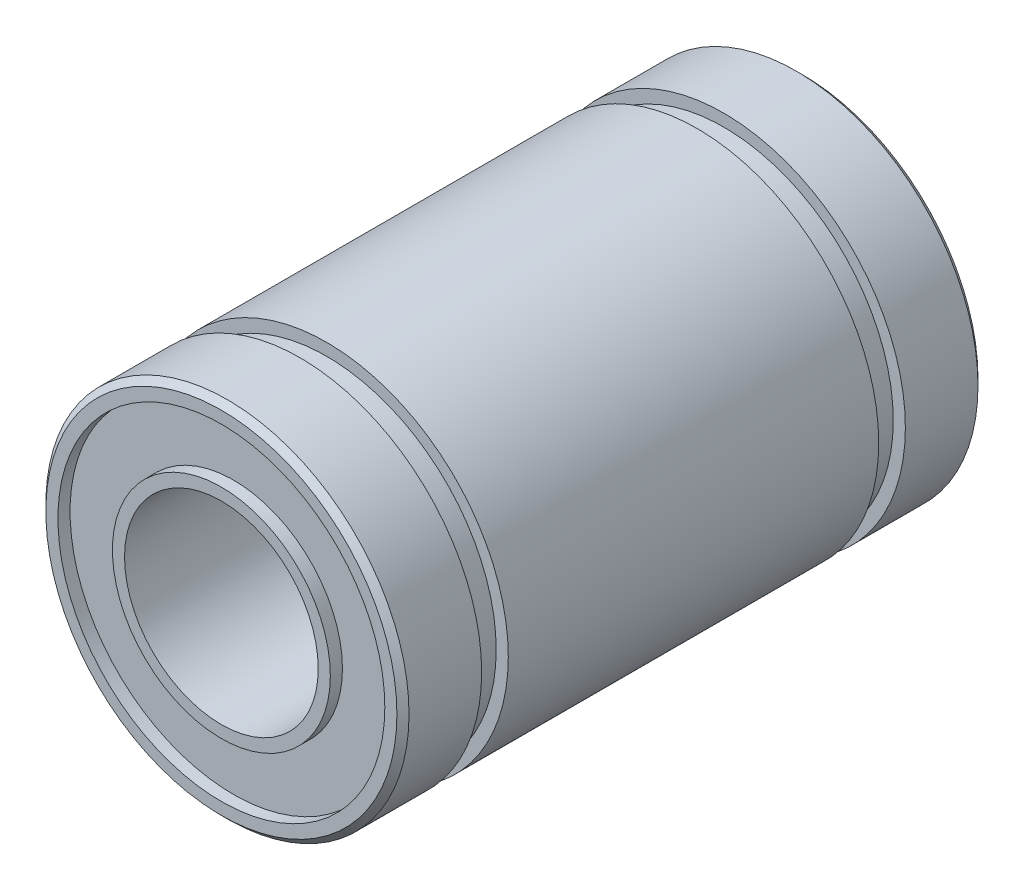
ISO-10303-21;
HEADER;
FILE_DESCRIPTION(('STEP AP214'),'2;1');
FILE_NAME('part.step','',(''),(''),'','','');
FILE_SCHEMA(('AUTOMOTIVE_DESIGN { 1 0 10303 214 1 1 1 1 }'));
ENDSEC;
DATA;
#1=APPLICATION_CONTEXT('core data for automotive mechanical design processes');
#2=APPLICATION_PROTOCOL_DEFINITION('international standard','automotive_design',2000,#1);
#3=PRODUCT_CONTEXT('',#1,'mechanical');
#4=PRODUCT('Part','Part','',(#3));
#5=PRODUCT_RELATED_PRODUCT_CATEGORY('part','',(#4));
#6=PRODUCT_DEFINITION_FORMATION('','',#4);
#7=PRODUCT_DEFINITION_CONTEXT('part definition',#1,'design');
#8=PRODUCT_DEFINITION('design','',#6,#7);
#9=PRODUCT_DEFINITION_SHAPE('','',#8);
#10=(LENGTH_UNIT() NAMED_UNIT(*) SI_UNIT(.MILLI.,.METRE.));
#11=(NAMED_UNIT(*) PLANE_ANGLE_UNIT() SI_UNIT($,.RADIAN.));
#12=(NAMED_UNIT(*) SI_UNIT($,.STERADIAN.) SOLID_ANGLE_UNIT());
#13=UNCERTAINTY_MEASURE_WITH_UNIT(LENGTH_MEASURE(1.E-05),#10,'distance_accuracy_value','');
#14=(GEOMETRIC_REPRESENTATION_CONTEXT(3) GLOBAL_UNCERTAINTY_ASSIGNED_CONTEXT((#13)) GLOBAL_UNIT_ASSIGNED_CONTEXT((#10,
#11,#12)) REPRESENTATION_CONTEXT('',''));
#15=CARTESIAN_POINT('',(0.,0.,0.));
#16=DIRECTION('',(0.,0.,1.));
#17=DIRECTION('',(1.,0.,0.));
#18=AXIS2_PLACEMENT_3D('',#15,#16,#17);
#19=CARTESIAN_POINT('',(0.,0.,-11.875));
#20=DIRECTION('',(0.,0.,1.));
#21=DIRECTION('',(-1.,0.,0.));
#22=AXIS2_PLACEMENT_3D('',#19,#20,#21);
#23=CONICAL_SURFACE('',#22,7.375,0.785398163400002);
#24=CARTESIAN_POINT('',(0.,0.,-11.75));
#25=DIRECTION('',(0.,0.,-1.));
#26=DIRECTION('',(-1.,0.,0.));
#27=AXIS2_PLACEMENT_3D('',#24,#25,#26);
#28=CIRCLE('',#27,7.5);
#29=CARTESIAN_POINT('',(7.5,0.,-11.75));
#30=VERTEX_POINT('',#29);
#31=EDGE_CURVE('E10',#30,#30,#28,.T.);
#32=ORIENTED_EDGE('',*,*,#31,.T.);
#33=EDGE_LOOP('',(#32));
#34=FACE_BOUND('',#33,.T.);
#35=CARTESIAN_POINT('',(0.,0.,-12.));
#36=DIRECTION('',(0.,0.,1.));
#37=DIRECTION('',(-1.,0.,0.));
#38=AXIS2_PLACEMENT_3D('',#35,#36,#37);
#39=CIRCLE('',#38,7.25);
#40=CARTESIAN_POINT('',(7.25,0.,-12.));
#41=VERTEX_POINT('',#40);
#42=EDGE_CURVE('E28',#41,#41,#39,.T.);
#43=ORIENTED_EDGE('',*,*,#42,.T.);
#44=EDGE_LOOP('',(#43));
#45=FACE_BOUND('',#44,.T.);
#46=ADVANCED_FACE('F17',(#34,#45),#23,.T.);
#47=CARTESIAN_POINT('',(0.,0.,0.));
#48=DIRECTION('',(0.,0.,1.));
#49=DIRECTION('',(-1.,0.,0.));
#50=AXIS2_PLACEMENT_3D('',#47,#48,#49);
#51=CYLINDRICAL_SURFACE('',#50,7.5);
#52=CARTESIAN_POINT('',(0.,0.,-8.75));
#53=DIRECTION('',(0.,0.,-1.));
#54=DIRECTION('',(-1.,0.,0.));
#55=AXIS2_PLACEMENT_3D('',#52,#53,#54);
#56=CIRCLE('',#55,7.5);
#57=CARTESIAN_POINT('',(7.5,0.,-8.75));
#58=VERTEX_POINT('',#57);
#59=EDGE_CURVE('E170',#58,#58,#56,.T.);
#60=ORIENTED_EDGE('',*,*,#59,.T.);
#61=EDGE_LOOP('',(#60));
#62=FACE_BOUND('',#61,.T.);
#63=ORIENTED_EDGE('',*,*,#31,.F.);
#64=EDGE_LOOP('',(#63));
#65=FACE_BOUND('',#64,.T.);
#66=ADVANCED_FACE('F236',(#62,#65),#51,.T.);
#67=CARTESIAN_POINT('',(0.,0.,-12.));
#68=DIRECTION('',(0.,0.,1.));
#69=DIRECTION('',(1.,0.,0.));
#70=AXIS2_PLACEMENT_3D('',#67,#68,#69);
#71=PLANE('',#70);
#72=ORIENTED_EDGE('',*,*,#42,.F.);
#73=EDGE_LOOP('',(#72));
#74=FACE_BOUND('',#73,.T.);
#75=CARTESIAN_POINT('',(0.,0.,-12.));
#76=DIRECTION('',(0.,0.,1.));
#77=DIRECTION('',(-1.,0.,0.));
#78=AXIS2_PLACEMENT_3D('',#75,#76,#77);
#79=CIRCLE('',#78,6.75);
#80=CARTESIAN_POINT('',(6.75,0.,-12.));
#81=VERTEX_POINT('',#80);
#82=EDGE_CURVE('E150',#81,#81,#79,.T.);
#83=ORIENTED_EDGE('',*,*,#82,.T.);
#84=EDGE_LOOP('',(#83));
#85=FACE_BOUND('',#84,.T.);
#86=ADVANCED_FACE('F268',(#74,#85),#71,.F.);
#87=CARTESIAN_POINT('',(0.,0.,11.875));
#88=DIRECTION('',(0.,0.,-1.));
#89=DIRECTION('',(-1.,0.,0.));
#90=AXIS2_PLACEMENT_3D('',#87,#88,#89);
#91=CONICAL_SURFACE('',#90,7.375,0.785398163400002);
#92=CARTESIAN_POINT('',(0.,0.,11.75));
#93=DIRECTION('',(0.,0.,1.));
#94=DIRECTION('',(-1.,0.,0.));
#95=AXIS2_PLACEMENT_3D('',#92,#93,#94);
#96=CIRCLE('',#95,7.5);
#97=CARTESIAN_POINT('',(7.5,0.,11.75));
#98=VERTEX_POINT('',#97);
#99=EDGE_CURVE('E141',#98,#98,#96,.T.);
#100=ORIENTED_EDGE('',*,*,#99,.T.);
#101=EDGE_LOOP('',(#100));
#102=FACE_BOUND('',#101,.T.);
#103=CARTESIAN_POINT('',(0.,0.,12.));
#104=DIRECTION('',(0.,0.,-1.));
#105=DIRECTION('',(-1.,0.,0.));
#106=AXIS2_PLACEMENT_3D('',#103,#104,#105);
#107=CIRCLE('',#106,7.25);
#108=CARTESIAN_POINT('',(7.25,0.,12.));
#109=VERTEX_POINT('',#108);
#110=EDGE_CURVE('E136',#109,#109,#107,.T.);
#111=ORIENTED_EDGE('',*,*,#110,.T.);
#112=EDGE_LOOP('',(#111));
#113=FACE_BOUND('',#112,.T.);
#114=ADVANCED_FACE('F277',(#102,#113),#91,.T.);
#115=CARTESIAN_POINT('',(0.,0.,12.));
#116=DIRECTION('',(0.,0.,1.));
#117=DIRECTION('',(1.,0.,0.));
#118=AXIS2_PLACEMENT_3D('',#115,#116,#117);
#119=PLANE('',#118);
#120=ORIENTED_EDGE('',*,*,#110,.F.);
#121=EDGE_LOOP('',(#120));
#122=FACE_BOUND('',#121,.T.);
#123=CARTESIAN_POINT('',(0.,0.,12.));
#124=DIRECTION('',(0.,0.,-1.));
#125=DIRECTION('',(-1.,0.,0.));
#126=AXIS2_PLACEMENT_3D('',#123,#124,#125);
#127=CIRCLE('',#126,6.75);
#128=CARTESIAN_POINT('',(6.75,0.,12.));
#129=VERTEX_POINT('',#128);
#130=EDGE_CURVE('E142',#129,#129,#127,.T.);
#131=ORIENTED_EDGE('',*,*,#130,.T.);
#132=EDGE_LOOP('',(#131));
#133=FACE_BOUND('',#132,.T.);
#134=ADVANCED_FACE('F137',(#122,#133),#119,.T.);
#135=CARTESIAN_POINT('',(0.,0.,0.));
#136=DIRECTION('',(0.,0.,1.));
#137=DIRECTION('',(-1.,0.,0.));
#138=AXIS2_PLACEMENT_3D('',#135,#136,#137);
#139=CYLINDRICAL_SURFACE('',#138,7.5);
#140=CARTESIAN_POINT('',(0.,0.,8.75));
#141=DIRECTION('',(0.,0.,1.));
#142=DIRECTION('',(-1.,0.,0.));
#143=AXIS2_PLACEMENT_3D('',#140,#141,#142);
#144=CIRCLE('',#143,7.5);
#145=CARTESIAN_POINT('',(7.5,0.,8.75));
#146=VERTEX_POINT('',#145);
#147=EDGE_CURVE('E153',#146,#146,#144,.T.);
#148=ORIENTED_EDGE('',*,*,#147,.T.);
#149=EDGE_LOOP('',(#148));
#150=FACE_BOUND('',#149,.T.);
#151=ORIENTED_EDGE('',*,*,#99,.F.);
#152=EDGE_LOOP('',(#151));
#153=FACE_BOUND('',#152,.T.);
#154=ADVANCED_FACE('F19',(#150,#153),#139,.T.);
#155=CARTESIAN_POINT('',(0.,0.,8.75));
#156=DIRECTION('',(0.,0.,1.));
#157=DIRECTION('',(1.,0.,0.));
#158=AXIS2_PLACEMENT_3D('',#155,#156,#157);
#159=PLANE('',#158);
#160=ORIENTED_EDGE('',*,*,#147,.F.);
#161=EDGE_LOOP('',(#160));
#162=FACE_BOUND('',#161,.T.);
#163=CARTESIAN_POINT('',(0.,0.,8.75));
#164=DIRECTION('',(0.,0.,-1.));
#165=DIRECTION('',(-1.,0.,0.));
#166=AXIS2_PLACEMENT_3D('',#163,#164,#165);
#167=CIRCLE('',#166,7.);
#168=CARTESIAN_POINT('',(7.,0.,8.75));
#169=VERTEX_POINT('',#168);
#170=EDGE_CURVE('E186',#169,#169,#167,.T.);
#171=ORIENTED_EDGE('',*,*,#170,.F.);
#172=EDGE_LOOP('',(#171));
#173=FACE_BOUND('',#172,.T.);
#174=ADVANCED_FACE('F301',(#162,#173),#159,.F.);
#175=CARTESIAN_POINT('',(0.,0.,7.65));
#176=DIRECTION('',(0.,0.,1.));
#177=DIRECTION('',(1.,0.,0.));
#178=AXIS2_PLACEMENT_3D('',#175,#176,#177);
#179=PLANE('',#178);
#180=CARTESIAN_POINT('',(0.,0.,7.65));
#181=DIRECTION('',(0.,0.,-1.));
#182=DIRECTION('',(-1.,0.,0.));
#183=AXIS2_PLACEMENT_3D('',#180,#181,#182);
#184=CIRCLE('',#183,7.5);
#185=CARTESIAN_POINT('',(7.5,0.,7.65));
#186=VERTEX_POINT('',#185);
#187=EDGE_CURVE('E157',#186,#186,#184,.T.);
#188=ORIENTED_EDGE('',*,*,#187,.F.);
#189=EDGE_LOOP('',(#188));
#190=FACE_BOUND('',#189,.T.);
#191=CARTESIAN_POINT('',(0.,0.,7.65));
#192=DIRECTION('',(0.,0.,1.));
#193=DIRECTION('',(-1.,0.,0.));
#194=AXIS2_PLACEMENT_3D('',#191,#192,#193);
#195=CIRCLE('',#194,7.);
#196=CARTESIAN_POINT('',(7.,0.,7.65));
#197=VERTEX_POINT('',#196);
#198=EDGE_CURVE('E190',#197,#197,#195,.T.);
#199=ORIENTED_EDGE('',*,*,#198,.F.);
#200=EDGE_LOOP('',(#199));
#201=FACE_BOUND('',#200,.T.);
#202=ADVANCED_FACE('F289',(#190,#201),#179,.T.);
#203=CARTESIAN_POINT('',(0.,0.,8.75));
#204=DIRECTION('',(0.,0.,-1.));
#205=DIRECTION('',(-1.,0.,0.));
#206=AXIS2_PLACEMENT_3D('',#203,#204,#205);
#207=CYLINDRICAL_SURFACE('',#206,7.);
#208=ORIENTED_EDGE('',*,*,#198,.T.);
#209=EDGE_LOOP('',(#208));
#210=FACE_BOUND('',#209,.T.);
#211=ORIENTED_EDGE('',*,*,#170,.T.);
#212=EDGE_LOOP('',(#211));
#213=FACE_BOUND('',#212,.T.);
#214=ADVANCED_FACE('F286',(#210,#213),#207,.T.);
#215=CARTESIAN_POINT('',(0.,0.,0.));
#216=DIRECTION('',(0.,0.,1.));
#217=DIRECTION('',(-1.,0.,0.));
#218=AXIS2_PLACEMENT_3D('',#215,#216,#217);
#219=CYLINDRICAL_SURFACE('',#218,7.5);
#220=ORIENTED_EDGE('',*,*,#187,.T.);
#221=EDGE_LOOP('',(#220));
#222=FACE_BOUND('',#221,.T.);
#223=CARTESIAN_POINT('',(0.,0.,-7.65));
#224=DIRECTION('',(0.,0.,1.));
#225=DIRECTION('',(-1.,0.,0.));
#226=AXIS2_PLACEMENT_3D('',#223,#224,#225);
#227=CIRCLE('',#226,7.5);
#228=CARTESIAN_POINT('',(7.5,0.,-7.65));
#229=VERTEX_POINT('',#228);
#230=EDGE_CURVE('E195',#229,#229,#227,.T.);
#231=ORIENTED_EDGE('',*,*,#230,.T.);
#232=EDGE_LOOP('',(#231));
#233=FACE_BOUND('',#232,.T.);
#234=ADVANCED_FACE('F288',(#222,#233),#219,.T.);
#235=CARTESIAN_POINT('',(0.,0.,-7.65));
#236=DIRECTION('',(0.,0.,1.));
#237=DIRECTION('',(1.,0.,0.));
#238=AXIS2_PLACEMENT_3D('',#235,#236,#237);
#239=PLANE('',#238);
#240=ORIENTED_EDGE('',*,*,#230,.F.);
#241=EDGE_LOOP('',(#240));
#242=FACE_BOUND('',#241,.T.);
#243=CARTESIAN_POINT('',(0.,0.,-7.65));
#244=DIRECTION('',(0.,0.,-1.));
#245=DIRECTION('',(-1.,0.,0.));
#246=AXIS2_PLACEMENT_3D('',#243,#244,#245);
#247=CIRCLE('',#246,7.);
#248=CARTESIAN_POINT('',(7.,0.,-7.65));
#249=VERTEX_POINT('',#248);
#250=EDGE_CURVE('E191',#249,#249,#247,.T.);
#251=ORIENTED_EDGE('',*,*,#250,.F.);
#252=EDGE_LOOP('',(#251));
#253=FACE_BOUND('',#252,.T.);
#254=ADVANCED_FACE('F242',(#242,#253),#239,.F.);
#255=CARTESIAN_POINT('',(0.,0.,-8.75));
#256=DIRECTION('',(0.,0.,1.));
#257=DIRECTION('',(1.,0.,0.));
#258=AXIS2_PLACEMENT_3D('',#255,#256,#257);
#259=PLANE('',#258);
#260=ORIENTED_EDGE('',*,*,#59,.F.);
#261=EDGE_LOOP('',(#260));
#262=FACE_BOUND('',#261,.T.);
#263=CARTESIAN_POINT('',(0.,0.,-8.75));
#264=DIRECTION('',(0.,0.,1.));
#265=DIRECTION('',(-1.,0.,0.));
#266=AXIS2_PLACEMENT_3D('',#263,#264,#265);
#267=CIRCLE('',#266,7.);
#268=CARTESIAN_POINT('',(7.,0.,-8.75));
#269=VERTEX_POINT('',#268);
#270=EDGE_CURVE('E196',#269,#269,#267,.T.);
#271=ORIENTED_EDGE('',*,*,#270,.F.);
#272=EDGE_LOOP('',(#271));
#273=FACE_BOUND('',#272,.T.);
#274=ADVANCED_FACE('F238',(#262,#273),#259,.T.);
#275=CARTESIAN_POINT('',(0.,0.,-8.75));
#276=DIRECTION('',(0.,0.,1.));
#277=DIRECTION('',(-1.,0.,0.));
#278=AXIS2_PLACEMENT_3D('',#275,#276,#277);
#279=CYLINDRICAL_SURFACE('',#278,7.);
#280=ORIENTED_EDGE('',*,*,#250,.T.);
#281=EDGE_LOOP('',(#280));
#282=FACE_BOUND('',#281,.T.);
#283=ORIENTED_EDGE('',*,*,#270,.T.);
#284=EDGE_LOOP('',(#283));
#285=FACE_BOUND('',#284,.T.);
#286=ADVANCED_FACE('F241',(#282,#285),#279,.T.);
#287=CARTESIAN_POINT('',(0.,0.,0.));
#288=DIRECTION('',(0.,0.,1.));
#289=DIRECTION('',(-1.,0.,0.));
#290=AXIS2_PLACEMENT_3D('',#287,#288,#289);
#291=CYLINDRICAL_SURFACE('',#290,6.75);
#292=ORIENTED_EDGE('',*,*,#130,.F.);
#293=EDGE_LOOP('',(#292));
#294=FACE_BOUND('',#293,.T.);
#295=CARTESIAN_POINT('',(0.,0.,11.5));
#296=DIRECTION('',(0.,0.,-1.));
#297=DIRECTION('',(-1.,0.,0.));
#298=AXIS2_PLACEMENT_3D('',#295,#296,#297);
#299=CIRCLE('',#298,6.75);
#300=CARTESIAN_POINT('',(6.75,0.,11.5));
#301=VERTEX_POINT('',#300);
#302=EDGE_CURVE('E197',#301,#301,#299,.T.);
#303=ORIENTED_EDGE('',*,*,#302,.T.);
#304=EDGE_LOOP('',(#303));
#305=FACE_BOUND('',#304,.T.);
#306=ADVANCED_FACE('F247',(#294,#305),#291,.F.);
#307=CARTESIAN_POINT('',(0.,0.,12.));
#308=DIRECTION('',(0.,0.,1.));
#309=DIRECTION('',(1.,0.,0.));
#310=AXIS2_PLACEMENT_3D('',#307,#308,#309);
#311=PLANE('',#310);
#312=CARTESIAN_POINT('',(0.,0.,12.));
#313=DIRECTION('',(0.,0.,1.));
#314=DIRECTION('',(-1.,0.,0.));
#315=AXIS2_PLACEMENT_3D('',#312,#313,#314);
#316=CIRCLE('',#315,4.5);
#317=CARTESIAN_POINT('',(4.5,0.,12.));
#318=VERTEX_POINT('',#317);
#319=EDGE_CURVE('E201',#318,#318,#316,.T.);
#320=ORIENTED_EDGE('',*,*,#319,.T.);
#321=EDGE_LOOP('',(#320));
#322=FACE_BOUND('',#321,.T.);
#323=CARTESIAN_POINT('',(0.,0.,12.));
#324=DIRECTION('',(0.,0.,-1.));
#325=DIRECTION('',(-1.,0.,0.));
#326=AXIS2_PLACEMENT_3D('',#323,#324,#325);
#327=CIRCLE('',#326,4.);
#328=CARTESIAN_POINT('',(4.,0.,12.));
#329=VERTEX_POINT('',#328);
#330=EDGE_CURVE('E176',#329,#329,#327,.T.);
#331=ORIENTED_EDGE('',*,*,#330,.T.);
#332=EDGE_LOOP('',(#331));
#333=FACE_BOUND('',#332,.T.);
#334=ADVANCED_FACE('F256',(#322,#333),#311,.T.);
#335=CARTESIAN_POINT('',(0.,0.,-12.));
#336=DIRECTION('',(0.,0.,1.));
#337=DIRECTION('',(1.,0.,0.));
#338=AXIS2_PLACEMENT_3D('',#335,#336,#337);
#339=PLANE('',#338);
#340=CARTESIAN_POINT('',(0.,0.,-12.));
#341=DIRECTION('',(0.,0.,-1.));
#342=DIRECTION('',(-1.,0.,0.));
#343=AXIS2_PLACEMENT_3D('',#340,#341,#342);
#344=CIRCLE('',#343,4.5);
#345=CARTESIAN_POINT('',(4.5,0.,-12.));
#346=VERTEX_POINT('',#345);
#347=EDGE_CURVE('E173',#346,#346,#344,.T.);
#348=ORIENTED_EDGE('',*,*,#347,.T.);
#349=EDGE_LOOP('',(#348));
#350=FACE_BOUND('',#349,.T.);
#351=CARTESIAN_POINT('',(0.,0.,-12.));
#352=DIRECTION('',(0.,0.,1.));
#353=DIRECTION('',(-1.,0.,0.));
#354=AXIS2_PLACEMENT_3D('',#351,#352,#353);
#355=CIRCLE('',#354,4.);
#356=CARTESIAN_POINT('',(4.,0.,-12.));
#357=VERTEX_POINT('',#356);
#358=EDGE_CURVE('E177',#357,#357,#355,.T.);
#359=ORIENTED_EDGE('',*,*,#358,.T.);
#360=EDGE_LOOP('',(#359));
#361=FACE_BOUND('',#360,.T.);
#362=ADVANCED_FACE('F315',(#350,#361),#339,.F.);
#363=CARTESIAN_POINT('',(0.,0.,0.));
#364=DIRECTION('',(0.,0.,1.));
#365=DIRECTION('',(-1.,0.,0.));
#366=AXIS2_PLACEMENT_3D('',#363,#364,#365);
#367=CYLINDRICAL_SURFACE('',#366,4.);
#368=ORIENTED_EDGE('',*,*,#358,.F.);
#369=EDGE_LOOP('',(#368));
#370=FACE_BOUND('',#369,.T.);
#371=ORIENTED_EDGE('',*,*,#330,.F.);
#372=EDGE_LOOP('',(#371));
#373=FACE_BOUND('',#372,.T.);
#374=ADVANCED_FACE('F298',(#370,#373),#367,.F.);
#375=CARTESIAN_POINT('',(0.,0.,0.));
#376=DIRECTION('',(0.,0.,1.));
#377=DIRECTION('',(-1.,0.,0.));
#378=AXIS2_PLACEMENT_3D('',#375,#376,#377);
#379=CYLINDRICAL_SURFACE('',#378,4.5);
#380=ORIENTED_EDGE('',*,*,#319,.F.);
#381=EDGE_LOOP('',(#380));
#382=FACE_BOUND('',#381,.T.);
#383=CARTESIAN_POINT('',(0.,0.,11.5));
#384=DIRECTION('',(0.,0.,1.));
#385=DIRECTION('',(-1.,0.,0.));
#386=AXIS2_PLACEMENT_3D('',#383,#384,#385);
#387=CIRCLE('',#386,4.5);
#388=CARTESIAN_POINT('',(4.5,0.,11.5));
#389=VERTEX_POINT('',#388);
#390=EDGE_CURVE('E185',#389,#389,#387,.T.);
#391=ORIENTED_EDGE('',*,*,#390,.T.);
#392=EDGE_LOOP('',(#391));
#393=FACE_BOUND('',#392,.T.);
#394=ADVANCED_FACE('F295',(#382,#393),#379,.T.);
#395=CARTESIAN_POINT('',(0.,0.,11.5));
#396=DIRECTION('',(0.,0.,1.));
#397=DIRECTION('',(1.,0.,0.));
#398=AXIS2_PLACEMENT_3D('',#395,#396,#397);
#399=PLANE('',#398);
#400=ORIENTED_EDGE('',*,*,#302,.F.);
#401=EDGE_LOOP('',(#400));
#402=FACE_BOUND('',#401,.T.);
#403=ORIENTED_EDGE('',*,*,#390,.F.);
#404=EDGE_LOOP('',(#403));
#405=FACE_BOUND('',#404,.T.);
#406=ADVANCED_FACE('F297',(#402,#405),#399,.T.);
#407=CARTESIAN_POINT('',(0.,0.,0.));
#408=DIRECTION('',(0.,0.,1.));
#409=DIRECTION('',(-1.,0.,0.));
#410=AXIS2_PLACEMENT_3D('',#407,#408,#409);
#411=CYLINDRICAL_SURFACE('',#410,6.75);
#412=ORIENTED_EDGE('',*,*,#82,.F.);
#413=EDGE_LOOP('',(#412));
#414=FACE_BOUND('',#413,.T.);
#415=CARTESIAN_POINT('',(0.,0.,-11.));
#416=DIRECTION('',(0.,0.,1.));
#417=DIRECTION('',(-1.,0.,0.));
#418=AXIS2_PLACEMENT_3D('',#415,#416,#417);
#419=CIRCLE('',#418,6.75);
#420=CARTESIAN_POINT('',(-6.75,0.,-11.));
#421=VERTEX_POINT('',#420);
#422=EDGE_CURVE('E21',#421,#421,#419,.T.);
#423=ORIENTED_EDGE('',*,*,#422,.T.);
#424=EDGE_LOOP('',(#423));
#425=FACE_BOUND('',#424,.T.);
#426=ADVANCED_FACE('F273',(#414,#425),#411,.F.);
#427=CARTESIAN_POINT('',(0.,0.,0.));
#428=DIRECTION('',(0.,0.,1.));
#429=DIRECTION('',(-1.,0.,0.));
#430=AXIS2_PLACEMENT_3D('',#427,#428,#429);
#431=CYLINDRICAL_SURFACE('',#430,4.5);
#432=ORIENTED_EDGE('',*,*,#347,.F.);
#433=EDGE_LOOP('',(#432));
#434=FACE_BOUND('',#433,.T.);
#435=CARTESIAN_POINT('',(0.,0.,-11.));
#436=DIRECTION('',(0.,0.,-1.));
#437=DIRECTION('',(-1.,0.,0.));
#438=AXIS2_PLACEMENT_3D('',#435,#436,#437);
#439=CIRCLE('',#438,4.5);
#440=CARTESIAN_POINT('',(-4.5,0.,-11.));
#441=VERTEX_POINT('',#440);
#442=EDGE_CURVE('E166',#441,#441,#439,.T.);
#443=ORIENTED_EDGE('',*,*,#442,.T.);
#444=EDGE_LOOP('',(#443));
#445=FACE_BOUND('',#444,.T.);
#446=ADVANCED_FACE('F495',(#434,#445),#431,.T.);
#447=CARTESIAN_POINT('',(0.,0.,-11.));
#448=DIRECTION('',(0.,0.,1.));
#449=DIRECTION('',(1.,0.,0.));
#450=AXIS2_PLACEMENT_3D('',#447,#448,#449);
#451=PLANE('',#450);
#452=ORIENTED_EDGE('',*,*,#422,.F.);
#453=EDGE_LOOP('',(#452));
#454=FACE_BOUND('',#453,.T.);
#455=ORIENTED_EDGE('',*,*,#442,.F.);
#456=EDGE_LOOP('',(#455));
#457=FACE_BOUND('',#456,.T.);
#458=ADVANCED_FACE('F503',(#454,#457),#451,.F.);
#459=CLOSED_SHELL('',(#46,#66,#86,#114,#134,#154,#174,#202,#214,#234,#254,#274,#286,#306,#334,
#362,#374,#394,#406,#426,#446,#458));
#460=CARTESIAN_POINT('',(0.,0.,0.));
#461=DIRECTION('',(0.,0.,1.));
#462=DIRECTION('',(-1.,0.,0.));
#463=AXIS2_PLACEMENT_3D('',#460,#461,#462);
#464=CYLINDRICAL_SURFACE('',#463,6.75);
#465=CARTESIAN_POINT('',(0.,0.,-10.));
#466=DIRECTION('',(0.,0.,-1.));
#467=DIRECTION('',(-1.,0.,0.));
#468=AXIS2_PLACEMENT_3D('',#465,#466,#467);
#469=CIRCLE('',#468,6.75);
#470=CARTESIAN_POINT('',(-6.75,0.,-10.));
#471=VERTEX_POINT('',#470);
#472=EDGE_CURVE('E163',#471,#471,#469,.T.);
#473=ORIENTED_EDGE('',*,*,#472,.T.);
#474=EDGE_LOOP('',(#473));
#475=FACE_BOUND('',#474,.T.);
#476=CARTESIAN_POINT('',(0.,0.,10.5));
#477=DIRECTION('',(0.,0.,1.));
#478=DIRECTION('',(-1.,0.,0.));
#479=AXIS2_PLACEMENT_3D('',#476,#477,#478);
#480=CIRCLE('',#479,6.75);
#481=CARTESIAN_POINT('',(6.75,0.,10.5));
#482=VERTEX_POINT('',#481);
#483=EDGE_CURVE('E158',#482,#482,#480,.T.);
#484=ORIENTED_EDGE('',*,*,#483,.T.);
#485=EDGE_LOOP('',(#484));
#486=FACE_BOUND('',#485,.T.);
#487=ADVANCED_FACE('F283',(#475,#486),#464,.F.);
#488=CARTESIAN_POINT('',(0.,0.,0.));
#489=DIRECTION('',(0.,0.,1.));
#490=DIRECTION('',(-1.,0.,0.));
#491=AXIS2_PLACEMENT_3D('',#488,#489,#490);
#492=CYLINDRICAL_SURFACE('',#491,4.5);
#493=CARTESIAN_POINT('',(0.,0.,-10.));
#494=DIRECTION('',(0.,0.,1.));
#495=DIRECTION('',(-1.,0.,0.));
#496=AXIS2_PLACEMENT_3D('',#493,#494,#495);
#497=CIRCLE('',#496,4.5);
#498=CARTESIAN_POINT('',(-4.5,0.,-10.));
#499=VERTEX_POINT('',#498);
#500=EDGE_CURVE('E161',#499,#499,#497,.T.);
#501=ORIENTED_EDGE('',*,*,#500,.T.);
#502=EDGE_LOOP('',(#501));
#503=FACE_BOUND('',#502,.T.);
#504=CARTESIAN_POINT('',(0.,0.,10.5));
#505=DIRECTION('',(0.,0.,-1.));
#506=DIRECTION('',(-1.,0.,0.));
#507=AXIS2_PLACEMENT_3D('',#504,#505,#506);
#508=CIRCLE('',#507,4.5);
#509=CARTESIAN_POINT('',(4.5,0.,10.5));
#510=VERTEX_POINT('',#509);
#511=EDGE_CURVE('E162',#510,#510,#508,.T.);
#512=ORIENTED_EDGE('',*,*,#511,.T.);
#513=EDGE_LOOP('',(#512));
#514=FACE_BOUND('',#513,.T.);
#515=ADVANCED_FACE('F279',(#503,#514),#492,.T.);
#516=CARTESIAN_POINT('',(0.,0.,10.5));
#517=DIRECTION('',(0.,0.,1.));
#518=DIRECTION('',(1.,0.,0.));
#519=AXIS2_PLACEMENT_3D('',#516,#517,#518);
#520=PLANE('',#519);
#521=ORIENTED_EDGE('',*,*,#483,.F.);
#522=EDGE_LOOP('',(#521));
#523=FACE_BOUND('',#522,.T.);
#524=ORIENTED_EDGE('',*,*,#511,.F.);
#525=EDGE_LOOP('',(#524));
#526=FACE_BOUND('',#525,.T.);
#527=ADVANCED_FACE('F282',(#523,#526),#520,.F.);
#528=CARTESIAN_POINT('',(0.,0.,-10.));
#529=DIRECTION('',(0.,0.,1.));
#530=DIRECTION('',(1.,0.,0.));
#531=AXIS2_PLACEMENT_3D('',#528,#529,#530);
#532=PLANE('',#531);
#533=ORIENTED_EDGE('',*,*,#472,.F.);
#534=EDGE_LOOP('',(#533));
#535=FACE_BOUND('',#534,.T.);
#536=ORIENTED_EDGE('',*,*,#500,.F.);
#537=EDGE_LOOP('',(#536));
#538=FACE_BOUND('',#537,.T.);
#539=ADVANCED_FACE('F308',(#535,#538),#532,.T.);
#540=CLOSED_SHELL('',(#487,#515,#527,#539));
#541=ORIENTED_CLOSED_SHELL('',*,#540,.T.);
#542=BREP_WITH_VOIDS('B1',#459,(#541));
#543=ADVANCED_BREP_SHAPE_REPRESENTATION('',(#18,#542),#14);
#544=SHAPE_DEFINITION_REPRESENTATION(#9,#543);
ENDSEC;
END-ISO-10303-21;
